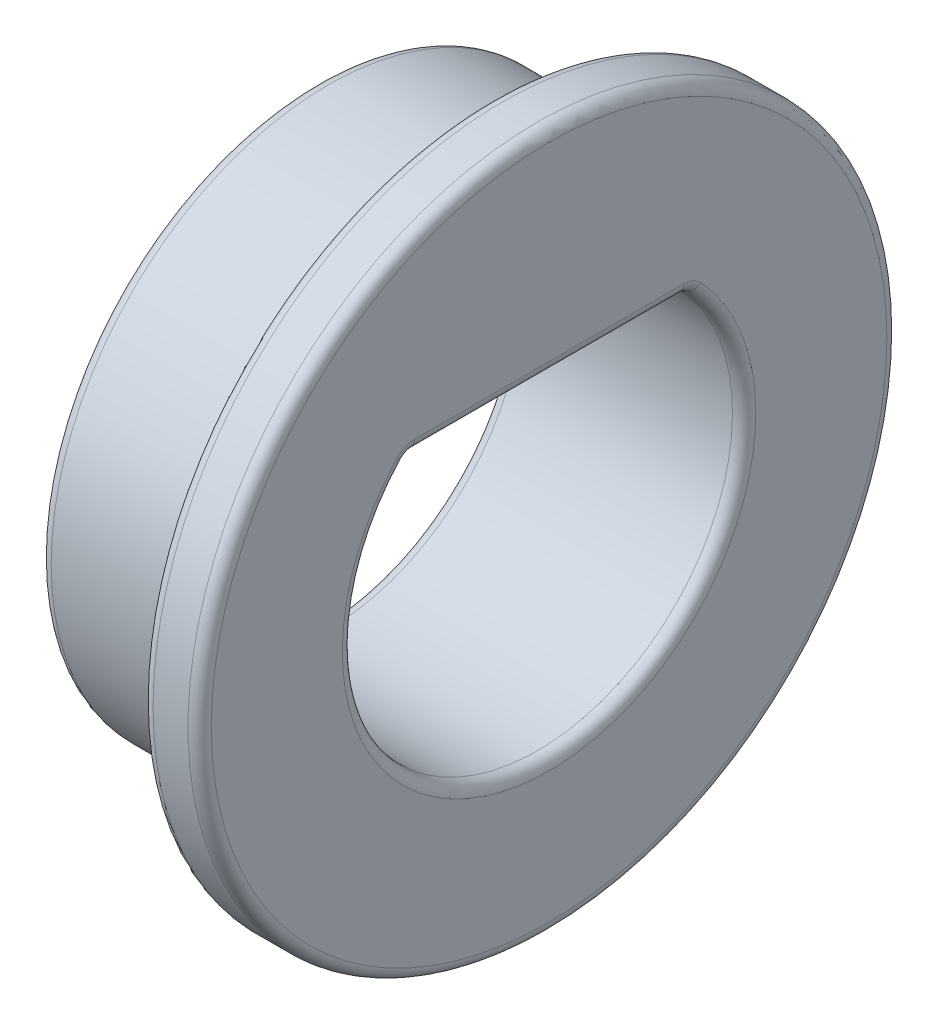
ISO-10303-21;
HEADER;
FILE_DESCRIPTION(('STEP AP214'),'2;1');
FILE_NAME('part.step','',(''),(''),'','','');
FILE_SCHEMA(('AUTOMOTIVE_DESIGN { 1 0 10303 214 1 1 1 1 }'));
ENDSEC;
DATA;
#1=APPLICATION_CONTEXT('core data for automotive mechanical design processes');
#2=APPLICATION_PROTOCOL_DEFINITION('international standard','automotive_design',2000,#1);
#3=PRODUCT_CONTEXT('',#1,'mechanical');
#4=PRODUCT('Part','Part','',(#3));
#5=PRODUCT_RELATED_PRODUCT_CATEGORY('part','',(#4));
#6=PRODUCT_DEFINITION_FORMATION('','',#4);
#7=PRODUCT_DEFINITION_CONTEXT('part definition',#1,'design');
#8=PRODUCT_DEFINITION('design','',#6,#7);
#9=PRODUCT_DEFINITION_SHAPE('','',#8);
#10=(LENGTH_UNIT() NAMED_UNIT(*) SI_UNIT(.MILLI.,.METRE.));
#11=(NAMED_UNIT(*) PLANE_ANGLE_UNIT() SI_UNIT($,.RADIAN.));
#12=(NAMED_UNIT(*) SI_UNIT($,.STERADIAN.) SOLID_ANGLE_UNIT());
#13=UNCERTAINTY_MEASURE_WITH_UNIT(LENGTH_MEASURE(1.E-05),#10,'distance_accuracy_value','');
#14=(GEOMETRIC_REPRESENTATION_CONTEXT(3) GLOBAL_UNCERTAINTY_ASSIGNED_CONTEXT((#13)) GLOBAL_UNIT_ASSIGNED_CONTEXT((#10,
#11,#12)) REPRESENTATION_CONTEXT('',''));
#15=CARTESIAN_POINT('',(0.,0.,0.));
#16=DIRECTION('',(0.,0.,1.));
#17=DIRECTION('',(1.,0.,0.));
#18=AXIS2_PLACEMENT_3D('',#15,#16,#17);
#19=CARTESIAN_POINT('',(-4.,0.,0.));
#20=DIRECTION('',(-1.,0.,0.));
#21=DIRECTION('',(0.,0.,1.));
#22=AXIS2_PLACEMENT_3D('',#19,#20,#21);
#23=PLANE('',#22);
#24=CARTESIAN_POINT('',(-4.,2.13719917850405,2.31406129378667));
#25=DIRECTION('',(-1.,0.,0.));
#26=DIRECTION('',(0.,0.,1.));
#27=AXIS2_PLACEMENT_3D('',#24,#25,#26);
#28=CIRCLE('',#27,0.4);
#29=CARTESIAN_POINT('',(-4.,2.40858955037758,2.60791034696593));
#30=VERTEX_POINT('',#29);
#31=CARTESIAN_POINT('',(-4.,2.53719917850405,2.31406129378667));
#32=VERTEX_POINT('',#31);
#33=EDGE_CURVE('E107',#30,#32,#28,.T.);
#34=ORIENTED_EDGE('',*,*,#33,.F.);
#35=CARTESIAN_POINT('',(-4.,0.,0.));
#36=DIRECTION('',(-1.,0.,0.));
#37=DIRECTION('',(0.,0.,1.));
#38=AXIS2_PLACEMENT_3D('',#35,#36,#37);
#39=CIRCLE('',#38,3.55);
#40=CARTESIAN_POINT('',(-4.,2.40858955037758,-2.60791034696593));
#41=VERTEX_POINT('',#40);
#42=EDGE_CURVE('E111',#30,#41,#39,.F.);
#43=ORIENTED_EDGE('',*,*,#42,.T.);
#44=CARTESIAN_POINT('',(-4.,2.13719917850405,-2.31406129378667));
#45=DIRECTION('',(-1.,0.,0.));
#46=DIRECTION('',(0.,0.,1.));
#47=AXIS2_PLACEMENT_3D('',#44,#45,#46);
#48=CIRCLE('',#47,0.4);
#49=CARTESIAN_POINT('',(-4.,2.53719917850405,-2.31406129378667));
#50=VERTEX_POINT('',#49);
#51=EDGE_CURVE('E137',#50,#41,#48,.T.);
#52=ORIENTED_EDGE('',*,*,#51,.F.);
#53=DIRECTION('',(0.,0.,1.));
#54=VECTOR('',#53,1.);
#55=CARTESIAN_POINT('',(-4.,2.53719917850405,2.4));
#56=LINE('',#55,#54);
#57=EDGE_CURVE('E113',#50,#32,#56,.T.);
#58=ORIENTED_EDGE('',*,*,#57,.T.);
#59=EDGE_LOOP('',(#34,#43,#52,#58));
#60=FACE_BOUND('',#59,.T.);
#61=CARTESIAN_POINT('',(-4.,0.,0.));
#62=DIRECTION('',(-1.,0.,0.));
#63=DIRECTION('',(0.,0.,1.));
#64=AXIS2_PLACEMENT_3D('',#61,#62,#63);
#65=CIRCLE('',#64,4.55);
#66=CARTESIAN_POINT('',(-4.,0.,4.55));
#67=VERTEX_POINT('',#66);
#68=EDGE_CURVE('E118',#67,#67,#65,.T.);
#69=ORIENTED_EDGE('',*,*,#68,.T.);
#70=EDGE_LOOP('',(#69));
#71=FACE_BOUND('',#70,.T.);
#72=ADVANCED_FACE('F39',(#60,#71),#23,.T.);
#73=CARTESIAN_POINT('',(0.,0.,0.));
#74=DIRECTION('',(1.,0.,0.));
#75=DIRECTION('',(0.,0.,-1.));
#76=AXIS2_PLACEMENT_3D('',#73,#74,#75);
#77=CYLINDRICAL_SURFACE('',#76,4.75);
#78=CARTESIAN_POINT('',(-1.2,0.,0.));
#79=DIRECTION('',(-1.,0.,0.));
#80=DIRECTION('',(0.,0.,1.));
#81=AXIS2_PLACEMENT_3D('',#78,#79,#80);
#82=CIRCLE('',#81,4.75);
#83=CARTESIAN_POINT('',(-1.2,0.,4.75));
#84=VERTEX_POINT('',#83);
#85=EDGE_CURVE('E11',#84,#84,#82,.T.);
#86=ORIENTED_EDGE('',*,*,#85,.T.);
#87=EDGE_LOOP('',(#86));
#88=FACE_BOUND('',#87,.T.);
#89=CARTESIAN_POINT('',(-3.8,0.,0.));
#90=DIRECTION('',(-1.,0.,0.));
#91=DIRECTION('',(0.,0.,1.));
#92=AXIS2_PLACEMENT_3D('',#89,#90,#91);
#93=CIRCLE('',#92,4.75);
#94=CARTESIAN_POINT('',(-3.8,0.,4.75));
#95=VERTEX_POINT('',#94);
#96=EDGE_CURVE('E49',#95,#95,#93,.F.);
#97=ORIENTED_EDGE('',*,*,#96,.T.);
#98=EDGE_LOOP('',(#97));
#99=FACE_BOUND('',#98,.T.);
#100=ADVANCED_FACE('F249',(#88,#99),#77,.T.);
#101=CARTESIAN_POINT('',(-1.,4.75,0.));
#102=DIRECTION('',(-1.,0.,0.));
#103=DIRECTION('',(0.,0.,1.));
#104=AXIS2_PLACEMENT_3D('',#101,#102,#103);
#105=PLANE('',#104);
#106=CARTESIAN_POINT('',(-1.,0.,0.));
#107=DIRECTION('',(-1.,0.,0.));
#108=DIRECTION('',(0.,0.,1.));
#109=AXIS2_PLACEMENT_3D('',#106,#107,#108);
#110=CIRCLE('',#109,5.8);
#111=CARTESIAN_POINT('',(-1.,0.,5.8));
#112=VERTEX_POINT('',#111);
#113=EDGE_CURVE('E195',#112,#112,#110,.T.);
#114=ORIENTED_EDGE('',*,*,#113,.T.);
#115=EDGE_LOOP('',(#114));
#116=FACE_BOUND('',#115,.T.);
#117=CARTESIAN_POINT('',(-1.,0.,0.));
#118=DIRECTION('',(-1.,0.,0.));
#119=DIRECTION('',(0.,0.,1.));
#120=AXIS2_PLACEMENT_3D('',#117,#118,#119);
#121=CIRCLE('',#120,4.95);
#122=CARTESIAN_POINT('',(-1.,0.,4.95));
#123=VERTEX_POINT('',#122);
#124=EDGE_CURVE('E191',#123,#123,#121,.F.);
#125=ORIENTED_EDGE('',*,*,#124,.T.);
#126=EDGE_LOOP('',(#125));
#127=FACE_BOUND('',#126,.T.);
#128=ADVANCED_FACE('F251',(#116,#127),#105,.T.);
#129=CARTESIAN_POINT('',(0.,0.,0.));
#130=DIRECTION('',(1.,0.,0.));
#131=DIRECTION('',(0.,0.,-1.));
#132=AXIS2_PLACEMENT_3D('',#129,#130,#131);
#133=CYLINDRICAL_SURFACE('',#132,6.);
#134=CARTESIAN_POINT('',(-0.2,0.,0.));
#135=DIRECTION('',(1.,0.,0.));
#136=DIRECTION('',(0.,0.,-1.));
#137=AXIS2_PLACEMENT_3D('',#134,#135,#136);
#138=CIRCLE('',#137,6.);
#139=CARTESIAN_POINT('',(-0.2,0.,-6.));
#140=VERTEX_POINT('',#139);
#141=EDGE_CURVE('E187',#140,#140,#138,.F.);
#142=ORIENTED_EDGE('',*,*,#141,.T.);
#143=EDGE_LOOP('',(#142));
#144=FACE_BOUND('',#143,.T.);
#145=CARTESIAN_POINT('',(-0.8,0.,0.));
#146=DIRECTION('',(-1.,0.,0.));
#147=DIRECTION('',(0.,0.,1.));
#148=AXIS2_PLACEMENT_3D('',#145,#146,#147);
#149=CIRCLE('',#148,6.);
#150=CARTESIAN_POINT('',(-0.8,0.,6.));
#151=VERTEX_POINT('',#150);
#152=EDGE_CURVE('E183',#151,#151,#149,.F.);
#153=ORIENTED_EDGE('',*,*,#152,.T.);
#154=EDGE_LOOP('',(#153));
#155=FACE_BOUND('',#154,.T.);
#156=ADVANCED_FACE('F258',(#144,#155),#133,.T.);
#157=CARTESIAN_POINT('',(0.,6.,0.));
#158=DIRECTION('',(1.,0.,0.));
#159=DIRECTION('',(0.,0.,-1.));
#160=AXIS2_PLACEMENT_3D('',#157,#158,#159);
#161=PLANE('',#160);
#162=CARTESIAN_POINT('',(0.,2.13719917850405,-2.31406129378667));
#163=DIRECTION('',(1.,0.,0.));
#164=DIRECTION('',(0.,0.,-1.));
#165=AXIS2_PLACEMENT_3D('',#162,#163,#164);
#166=CIRCLE('',#165,0.4);
#167=CARTESIAN_POINT('',(0.,2.40858955037758,-2.60791034696593));
#168=VERTEX_POINT('',#167);
#169=CARTESIAN_POINT('',(0.,2.53719917850405,-2.31406129378667));
#170=VERTEX_POINT('',#169);
#171=EDGE_CURVE('E159',#168,#170,#166,.T.);
#172=ORIENTED_EDGE('',*,*,#171,.F.);
#173=CARTESIAN_POINT('',(0.,0.,0.));
#174=DIRECTION('',(1.,0.,0.));
#175=DIRECTION('',(0.,0.,-1.));
#176=AXIS2_PLACEMENT_3D('',#173,#174,#175);
#177=CIRCLE('',#176,3.55);
#178=CARTESIAN_POINT('',(0.,2.40858955037758,2.60791034696593));
#179=VERTEX_POINT('',#178);
#180=EDGE_CURVE('E169',#168,#179,#177,.F.);
#181=ORIENTED_EDGE('',*,*,#180,.T.);
#182=CARTESIAN_POINT('',(0.,2.13719917850405,2.31406129378667));
#183=DIRECTION('',(1.,0.,0.));
#184=DIRECTION('',(0.,0.,-1.));
#185=AXIS2_PLACEMENT_3D('',#182,#183,#184);
#186=CIRCLE('',#185,0.4);
#187=CARTESIAN_POINT('',(0.,2.53719917850405,2.31406129378667));
#188=VERTEX_POINT('',#187);
#189=EDGE_CURVE('E166',#188,#179,#186,.T.);
#190=ORIENTED_EDGE('',*,*,#189,.F.);
#191=DIRECTION('',(0.,0.,1.));
#192=VECTOR('',#191,1.);
#193=CARTESIAN_POINT('',(0.,2.53719917850405,-2.4));
#194=LINE('',#193,#192);
#195=EDGE_CURVE('E163',#188,#170,#194,.F.);
#196=ORIENTED_EDGE('',*,*,#195,.T.);
#197=EDGE_LOOP('',(#172,#181,#190,#196));
#198=FACE_BOUND('',#197,.T.);
#199=CARTESIAN_POINT('',(0.,0.,0.));
#200=DIRECTION('',(1.,0.,0.));
#201=DIRECTION('',(0.,0.,-1.));
#202=AXIS2_PLACEMENT_3D('',#199,#200,#201);
#203=CIRCLE('',#202,5.8);
#204=CARTESIAN_POINT('',(0.,0.,-5.8));
#205=VERTEX_POINT('',#204);
#206=EDGE_CURVE('E155',#205,#205,#203,.T.);
#207=ORIENTED_EDGE('',*,*,#206,.T.);
#208=EDGE_LOOP('',(#207));
#209=FACE_BOUND('',#208,.T.);
#210=ADVANCED_FACE('F400',(#198,#209),#161,.T.);
#211=CARTESIAN_POINT('',(-4.001,0.,0.));
#212=DIRECTION('',(1.,0.,0.));
#213=DIRECTION('',(0.,0.,-1.));
#214=AXIS2_PLACEMENT_3D('',#211,#212,#213);
#215=CYLINDRICAL_SURFACE('',#214,3.35);
#216=CARTESIAN_POINT('',(-3.8,0.,0.));
#217=DIRECTION('',(-1.,0.,0.));
#218=DIRECTION('',(0.,0.,1.));
#219=AXIS2_PLACEMENT_3D('',#216,#217,#218);
#220=CIRCLE('',#219,3.35);
#221=CARTESIAN_POINT('',(-3.8,2.27289436444081,-2.4609858203763));
#222=VERTEX_POINT('',#221);
#223=CARTESIAN_POINT('',(-3.8,2.27289436444081,2.4609858203763));
#224=VERTEX_POINT('',#223);
#225=EDGE_CURVE('E148',#222,#224,#220,.T.);
#226=ORIENTED_EDGE('',*,*,#225,.T.);
#227=DIRECTION('',(1.,0.,0.));
#228=VECTOR('',#227,1.);
#229=CARTESIAN_POINT('',(-4.001,2.27289436444081,2.4609858203763));
#230=LINE('',#229,#228);
#231=CARTESIAN_POINT('',(-0.200000000000001,2.27289436444081,2.4609858203763));
#232=VERTEX_POINT('',#231);
#233=EDGE_CURVE('E152',#224,#232,#230,.T.);
#234=ORIENTED_EDGE('',*,*,#233,.T.);
#235=CARTESIAN_POINT('',(-0.200000000000001,0.,0.));
#236=DIRECTION('',(1.,0.,0.));
#237=DIRECTION('',(0.,0.,-1.));
#238=AXIS2_PLACEMENT_3D('',#235,#236,#237);
#239=CIRCLE('',#238,3.35);
#240=CARTESIAN_POINT('',(-0.200000000000001,2.27289436444081,-2.4609858203763));
#241=VERTEX_POINT('',#240);
#242=EDGE_CURVE('E141',#232,#241,#239,.T.);
#243=ORIENTED_EDGE('',*,*,#242,.T.);
#244=DIRECTION('',(1.,0.,0.));
#245=VECTOR('',#244,1.);
#246=CARTESIAN_POINT('',(-4.001,2.27289436444081,-2.4609858203763));
#247=LINE('',#246,#245);
#248=EDGE_CURVE('E136',#241,#222,#247,.F.);
#249=ORIENTED_EDGE('',*,*,#248,.T.);
#250=EDGE_LOOP('',(#226,#234,#243,#249));
#251=FACE_BOUND('',#250,.T.);
#252=ADVANCED_FACE('F392',(#251),#215,.F.);
#253=CARTESIAN_POINT('',(-4.001,2.33719917850405,2.4));
#254=DIRECTION('',(0.,1.,0.));
#255=DIRECTION('',(0.,0.,1.));
#256=AXIS2_PLACEMENT_3D('',#253,#254,#255);
#257=PLANE('',#256);
#258=DIRECTION('',(-1.,0.,0.));
#259=VECTOR('',#258,1.);
#260=CARTESIAN_POINT('',(-4.,2.33719917850405,2.31406129378667));
#261=LINE('',#260,#259);
#262=CARTESIAN_POINT('',(-0.200000000000001,2.33719917850405,2.31406129378667));
#263=VERTEX_POINT('',#262);
#264=CARTESIAN_POINT('',(-3.8,2.33719917850405,2.31406129378667));
#265=VERTEX_POINT('',#264);
#266=EDGE_CURVE('E57',#263,#265,#261,.T.);
#267=ORIENTED_EDGE('',*,*,#266,.T.);
#268=DIRECTION('',(0.,0.,1.));
#269=VECTOR('',#268,1.);
#270=CARTESIAN_POINT('',(-3.8,2.33719917850405,-2.4));
#271=LINE('',#270,#269);
#272=CARTESIAN_POINT('',(-3.8,2.33719917850405,-2.31406129378667));
#273=VERTEX_POINT('',#272);
#274=EDGE_CURVE('E180',#265,#273,#271,.F.);
#275=ORIENTED_EDGE('',*,*,#274,.T.);
#276=DIRECTION('',(-1.,0.,0.));
#277=VECTOR('',#276,1.);
#278=CARTESIAN_POINT('',(0.,2.33719917850405,-2.31406129378667));
#279=LINE('',#278,#277);
#280=CARTESIAN_POINT('',(-0.200000000000001,2.33719917850405,-2.31406129378667));
#281=VERTEX_POINT('',#280);
#282=EDGE_CURVE('E173',#273,#281,#279,.F.);
#283=ORIENTED_EDGE('',*,*,#282,.T.);
#284=DIRECTION('',(0.,0.,1.));
#285=VECTOR('',#284,1.);
#286=CARTESIAN_POINT('',(-0.200000000000001,2.33719917850405,2.4));
#287=LINE('',#286,#285);
#288=EDGE_CURVE('E62',#281,#263,#287,.T.);
#289=ORIENTED_EDGE('',*,*,#288,.T.);
#290=EDGE_LOOP('',(#267,#275,#283,#289));
#291=FACE_BOUND('',#290,.T.);
#292=ADVANCED_FACE('F299',(#291),#257,.F.);
#293=CARTESIAN_POINT('',(-0.200000000000001,2.53719917850405,2.4));
#294=DIRECTION('',(0.,0.,-1.));
#295=DIRECTION('',(-1.,0.,0.));
#296=AXIS2_PLACEMENT_3D('',#293,#294,#295);
#297=CYLINDRICAL_SURFACE('',#296,0.2);
#298=CARTESIAN_POINT('',(-0.2,2.53719917850405,-2.31406129378667));
#299=DIRECTION('',(0.,0.,-1.));
#300=DIRECTION('',(-1.,0.,0.));
#301=AXIS2_PLACEMENT_3D('',#298,#299,#300);
#302=CIRCLE('',#301,0.2);
#303=EDGE_CURVE('E227',#170,#281,#302,.T.);
#304=ORIENTED_EDGE('',*,*,#303,.F.);
#305=ORIENTED_EDGE('',*,*,#195,.F.);
#306=CARTESIAN_POINT('',(-0.200000000000001,2.53719917850405,2.31406129378667));
#307=DIRECTION('',(0.,0.,1.));
#308=DIRECTION('',(1.,0.,0.));
#309=AXIS2_PLACEMENT_3D('',#306,#307,#308);
#310=CIRCLE('',#309,0.2);
#311=EDGE_CURVE('E230',#263,#188,#310,.T.);
#312=ORIENTED_EDGE('',*,*,#311,.F.);
#313=ORIENTED_EDGE('',*,*,#288,.F.);
#314=EDGE_LOOP('',(#304,#305,#312,#313));
#315=FACE_BOUND('',#314,.T.);
#316=ADVANCED_FACE('F295',(#315),#297,.T.);
#317=CARTESIAN_POINT('',(-0.200000000000001,0.,0.));
#318=DIRECTION('',(1.,0.,0.));
#319=DIRECTION('',(0.,0.,-1.));
#320=AXIS2_PLACEMENT_3D('',#317,#318,#319);
#321=TOROIDAL_SURFACE('',#320,3.55,0.2);
#322=CARTESIAN_POINT('',(-0.2,2.40858955037758,2.60791034696593));
#323=DIRECTION('',(0.,0.734622632948148,-0.678475929683825));
#324=DIRECTION('',(0.,0.678475929683825,0.734622632948148));
#325=AXIS2_PLACEMENT_3D('',#322,#323,#324);
#326=CIRCLE('',#325,0.2);
#327=EDGE_CURVE('E43',#179,#232,#326,.T.);
#328=ORIENTED_EDGE('',*,*,#327,.F.);
#329=ORIENTED_EDGE('',*,*,#180,.F.);
#330=CARTESIAN_POINT('',(-0.200000000000001,2.40858955037758,-2.60791034696593));
#331=DIRECTION('',(0.,0.734622632948148,0.678475929683825));
#332=DIRECTION('',(0.,-0.678475929683825,0.734622632948148));
#333=AXIS2_PLACEMENT_3D('',#330,#331,#332);
#334=CIRCLE('',#333,0.2);
#335=EDGE_CURVE('E223',#241,#168,#334,.T.);
#336=ORIENTED_EDGE('',*,*,#335,.F.);
#337=ORIENTED_EDGE('',*,*,#242,.F.);
#338=EDGE_LOOP('',(#328,#329,#336,#337));
#339=FACE_BOUND('',#338,.T.);
#340=ADVANCED_FACE('F292',(#339),#321,.T.);
#341=CARTESIAN_POINT('',(-0.200000000000001,2.13719917850405,2.31406129378667));
#342=DIRECTION('',(1.,0.,0.));
#343=DIRECTION('',(0.,0.,-1.));
#344=AXIS2_PLACEMENT_3D('',#341,#342,#343);
#345=TOROIDAL_SURFACE('',#344,0.4,0.2);
#346=ORIENTED_EDGE('',*,*,#189,.T.);
#347=ORIENTED_EDGE('',*,*,#327,.T.);
#348=CARTESIAN_POINT('',(-0.200000000000001,2.13719917850405,2.31406129378667));
#349=DIRECTION('',(1.,0.,0.));
#350=DIRECTION('',(0.,0.,-1.));
#351=AXIS2_PLACEMENT_3D('',#348,#349,#350);
#352=CIRCLE('',#351,0.2);
#353=EDGE_CURVE('E219',#263,#232,#352,.T.);
#354=ORIENTED_EDGE('',*,*,#353,.F.);
#355=ORIENTED_EDGE('',*,*,#311,.T.);
#356=EDGE_LOOP('',(#346,#347,#354,#355));
#357=FACE_BOUND('',#356,.T.);
#358=ADVANCED_FACE('F288',(#357),#345,.T.);
#359=CARTESIAN_POINT('',(-0.200000000000001,2.13719917850405,-2.31406129378667));
#360=DIRECTION('',(1.,0.,0.));
#361=DIRECTION('',(0.,0.,-1.));
#362=AXIS2_PLACEMENT_3D('',#359,#360,#361);
#363=TOROIDAL_SURFACE('',#362,0.4,0.2);
#364=ORIENTED_EDGE('',*,*,#171,.T.);
#365=ORIENTED_EDGE('',*,*,#303,.T.);
#366=CARTESIAN_POINT('',(-0.200000000000001,2.13719917850405,-2.31406129378667));
#367=DIRECTION('',(1.,0.,0.));
#368=DIRECTION('',(0.,0.,-1.));
#369=AXIS2_PLACEMENT_3D('',#366,#367,#368);
#370=CIRCLE('',#369,0.2);
#371=EDGE_CURVE('E215',#241,#281,#370,.T.);
#372=ORIENTED_EDGE('',*,*,#371,.F.);
#373=ORIENTED_EDGE('',*,*,#335,.T.);
#374=EDGE_LOOP('',(#364,#365,#372,#373));
#375=FACE_BOUND('',#374,.T.);
#376=ADVANCED_FACE('F284',(#375),#363,.T.);
#377=CARTESIAN_POINT('',(-4.001,2.13719917850405,2.31406129378667));
#378=DIRECTION('',(1.,0.,0.));
#379=DIRECTION('',(0.,0.,-1.));
#380=AXIS2_PLACEMENT_3D('',#377,#378,#379);
#381=CYLINDRICAL_SURFACE('',#380,0.2);
#382=ORIENTED_EDGE('',*,*,#353,.T.);
#383=ORIENTED_EDGE('',*,*,#233,.F.);
#384=CARTESIAN_POINT('',(-3.8,2.13719917850405,2.31406129378667));
#385=DIRECTION('',(-1.,0.,0.));
#386=DIRECTION('',(0.,0.,1.));
#387=AXIS2_PLACEMENT_3D('',#384,#385,#386);
#388=CIRCLE('',#387,0.2);
#389=EDGE_CURVE('E124',#265,#224,#388,.F.);
#390=ORIENTED_EDGE('',*,*,#389,.F.);
#391=ORIENTED_EDGE('',*,*,#266,.F.);
#392=EDGE_LOOP('',(#382,#383,#390,#391));
#393=FACE_BOUND('',#392,.T.);
#394=ADVANCED_FACE('F280',(#393),#381,.F.);
#395=CARTESIAN_POINT('',(-3.8,2.53719917850405,0.));
#396=DIRECTION('',(0.,0.,-1.));
#397=DIRECTION('',(-1.,0.,0.));
#398=AXIS2_PLACEMENT_3D('',#395,#396,#397);
#399=CYLINDRICAL_SURFACE('',#398,0.2);
#400=CARTESIAN_POINT('',(-3.8,2.53719917850405,-2.31406129378667));
#401=DIRECTION('',(0.,0.,-1.));
#402=DIRECTION('',(-1.,0.,0.));
#403=AXIS2_PLACEMENT_3D('',#400,#401,#402);
#404=CIRCLE('',#403,0.2);
#405=EDGE_CURVE('E206',#273,#50,#404,.T.);
#406=ORIENTED_EDGE('',*,*,#405,.F.);
#407=ORIENTED_EDGE('',*,*,#274,.F.);
#408=CARTESIAN_POINT('',(-3.8,2.53719917850405,2.31406129378667));
#409=DIRECTION('',(0.,0.,1.));
#410=DIRECTION('',(1.,0.,0.));
#411=AXIS2_PLACEMENT_3D('',#408,#409,#410);
#412=CIRCLE('',#411,0.2);
#413=EDGE_CURVE('E210',#32,#265,#412,.T.);
#414=ORIENTED_EDGE('',*,*,#413,.F.);
#415=ORIENTED_EDGE('',*,*,#57,.F.);
#416=EDGE_LOOP('',(#406,#407,#414,#415));
#417=FACE_BOUND('',#416,.T.);
#418=ADVANCED_FACE('F276',(#417),#399,.T.);
#419=CARTESIAN_POINT('',(-4.001,2.13719917850405,-2.31406129378667));
#420=DIRECTION('',(1.,0.,0.));
#421=DIRECTION('',(0.,0.,-1.));
#422=AXIS2_PLACEMENT_3D('',#419,#420,#421);
#423=CYLINDRICAL_SURFACE('',#422,0.2);
#424=ORIENTED_EDGE('',*,*,#371,.T.);
#425=ORIENTED_EDGE('',*,*,#282,.F.);
#426=CARTESIAN_POINT('',(-3.8,2.13719917850405,-2.31406129378667));
#427=DIRECTION('',(-1.,0.,0.));
#428=DIRECTION('',(0.,0.,1.));
#429=AXIS2_PLACEMENT_3D('',#426,#427,#428);
#430=CIRCLE('',#429,0.2);
#431=EDGE_CURVE('E129',#222,#273,#430,.F.);
#432=ORIENTED_EDGE('',*,*,#431,.F.);
#433=ORIENTED_EDGE('',*,*,#248,.F.);
#434=EDGE_LOOP('',(#424,#425,#432,#433));
#435=FACE_BOUND('',#434,.T.);
#436=ADVANCED_FACE('F273',(#435),#423,.F.);
#437=CARTESIAN_POINT('',(-3.8,2.13719917850405,2.31406129378667));
#438=DIRECTION('',(-1.,0.,0.));
#439=DIRECTION('',(0.,0.,1.));
#440=AXIS2_PLACEMENT_3D('',#437,#438,#439);
#441=TOROIDAL_SURFACE('',#440,0.4,0.2);
#442=ORIENTED_EDGE('',*,*,#413,.T.);
#443=ORIENTED_EDGE('',*,*,#389,.T.);
#444=CARTESIAN_POINT('',(-3.8,2.40858955037758,2.60791034696593));
#445=DIRECTION('',(0.,0.734622632948148,-0.678475929683825));
#446=DIRECTION('',(0.,0.678475929683825,0.734622632948148));
#447=AXIS2_PLACEMENT_3D('',#444,#445,#446);
#448=CIRCLE('',#447,0.2);
#449=EDGE_CURVE('E121',#30,#224,#448,.F.);
#450=ORIENTED_EDGE('',*,*,#449,.F.);
#451=ORIENTED_EDGE('',*,*,#33,.T.);
#452=EDGE_LOOP('',(#442,#443,#450,#451));
#453=FACE_BOUND('',#452,.T.);
#454=ADVANCED_FACE('F122',(#453),#441,.T.);
#455=CARTESIAN_POINT('',(-3.8,2.13719917850405,-2.31406129378667));
#456=DIRECTION('',(-1.,0.,0.));
#457=DIRECTION('',(0.,0.,1.));
#458=AXIS2_PLACEMENT_3D('',#455,#456,#457);
#459=TOROIDAL_SURFACE('',#458,0.4,0.2);
#460=ORIENTED_EDGE('',*,*,#405,.T.);
#461=ORIENTED_EDGE('',*,*,#51,.T.);
#462=CARTESIAN_POINT('',(-3.8,2.40858955037758,-2.60791034696593));
#463=DIRECTION('',(0.,0.734622632948148,0.678475929683825));
#464=DIRECTION('',(0.,-0.678475929683825,0.734622632948148));
#465=AXIS2_PLACEMENT_3D('',#462,#463,#464);
#466=CIRCLE('',#465,0.2);
#467=EDGE_CURVE('E130',#222,#41,#466,.F.);
#468=ORIENTED_EDGE('',*,*,#467,.F.);
#469=ORIENTED_EDGE('',*,*,#431,.T.);
#470=EDGE_LOOP('',(#460,#461,#468,#469));
#471=FACE_BOUND('',#470,.T.);
#472=ADVANCED_FACE('F267',(#471),#459,.T.);
#473=CARTESIAN_POINT('',(-3.8,0.,0.));
#474=DIRECTION('',(-1.,0.,0.));
#475=DIRECTION('',(0.,0.,1.));
#476=AXIS2_PLACEMENT_3D('',#473,#474,#475);
#477=TOROIDAL_SURFACE('',#476,3.55,0.2);
#478=ORIENTED_EDGE('',*,*,#449,.T.);
#479=ORIENTED_EDGE('',*,*,#225,.F.);
#480=ORIENTED_EDGE('',*,*,#467,.T.);
#481=ORIENTED_EDGE('',*,*,#42,.F.);
#482=EDGE_LOOP('',(#478,#479,#480,#481));
#483=FACE_BOUND('',#482,.T.);
#484=ADVANCED_FACE('F132',(#483),#477,.T.);
#485=CARTESIAN_POINT('',(-0.2,0.,0.));
#486=DIRECTION('',(1.,0.,0.));
#487=DIRECTION('',(0.,0.,-1.));
#488=AXIS2_PLACEMENT_3D('',#485,#486,#487);
#489=TOROIDAL_SURFACE('',#488,5.8,0.2);
#490=ORIENTED_EDGE('',*,*,#141,.F.);
#491=EDGE_LOOP('',(#490));
#492=FACE_BOUND('',#491,.T.);
#493=ORIENTED_EDGE('',*,*,#206,.F.);
#494=EDGE_LOOP('',(#493));
#495=FACE_BOUND('',#494,.T.);
#496=ADVANCED_FACE('F266',(#492,#495),#489,.T.);
#497=CARTESIAN_POINT('',(-0.8,0.,0.));
#498=DIRECTION('',(-1.,0.,0.));
#499=DIRECTION('',(0.,0.,1.));
#500=AXIS2_PLACEMENT_3D('',#497,#498,#499);
#501=TOROIDAL_SURFACE('',#500,5.8,0.2);
#502=ORIENTED_EDGE('',*,*,#113,.F.);
#503=EDGE_LOOP('',(#502));
#504=FACE_BOUND('',#503,.T.);
#505=ORIENTED_EDGE('',*,*,#152,.F.);
#506=EDGE_LOOP('',(#505));
#507=FACE_BOUND('',#506,.T.);
#508=ADVANCED_FACE('F303',(#504,#507),#501,.T.);
#509=CARTESIAN_POINT('',(-1.2,0.,0.));
#510=DIRECTION('',(-1.,0.,0.));
#511=DIRECTION('',(0.,0.,1.));
#512=AXIS2_PLACEMENT_3D('',#509,#510,#511);
#513=TOROIDAL_SURFACE('',#512,4.95,0.2);
#514=ORIENTED_EDGE('',*,*,#85,.F.);
#515=EDGE_LOOP('',(#514));
#516=FACE_BOUND('',#515,.T.);
#517=ORIENTED_EDGE('',*,*,#124,.F.);
#518=EDGE_LOOP('',(#517));
#519=FACE_BOUND('',#518,.T.);
#520=ADVANCED_FACE('F246',(#516,#519),#513,.F.);
#521=CARTESIAN_POINT('',(-3.8,0.,0.));
#522=DIRECTION('',(-1.,0.,0.));
#523=DIRECTION('',(0.,0.,1.));
#524=AXIS2_PLACEMENT_3D('',#521,#522,#523);
#525=TOROIDAL_SURFACE('',#524,4.55,0.2);
#526=ORIENTED_EDGE('',*,*,#68,.F.);
#527=EDGE_LOOP('',(#526));
#528=FACE_BOUND('',#527,.T.);
#529=ORIENTED_EDGE('',*,*,#96,.F.);
#530=EDGE_LOOP('',(#529));
#531=FACE_BOUND('',#530,.T.);
#532=ADVANCED_FACE('F41',(#528,#531),#525,.T.);
#533=CLOSED_SHELL('',(#72,#100,#128,#156,#210,#252,#292,#316,#340,#358,#376,#394,#418,#436,#454,
#472,#484,#496,#508,#520,#532));
#534=MANIFOLD_SOLID_BREP('B2',#533);
#535=ADVANCED_BREP_SHAPE_REPRESENTATION('',(#18,#534),#14);
#536=SHAPE_DEFINITION_REPRESENTATION(#9,#535);
ENDSEC;
END-ISO-10303-21;
